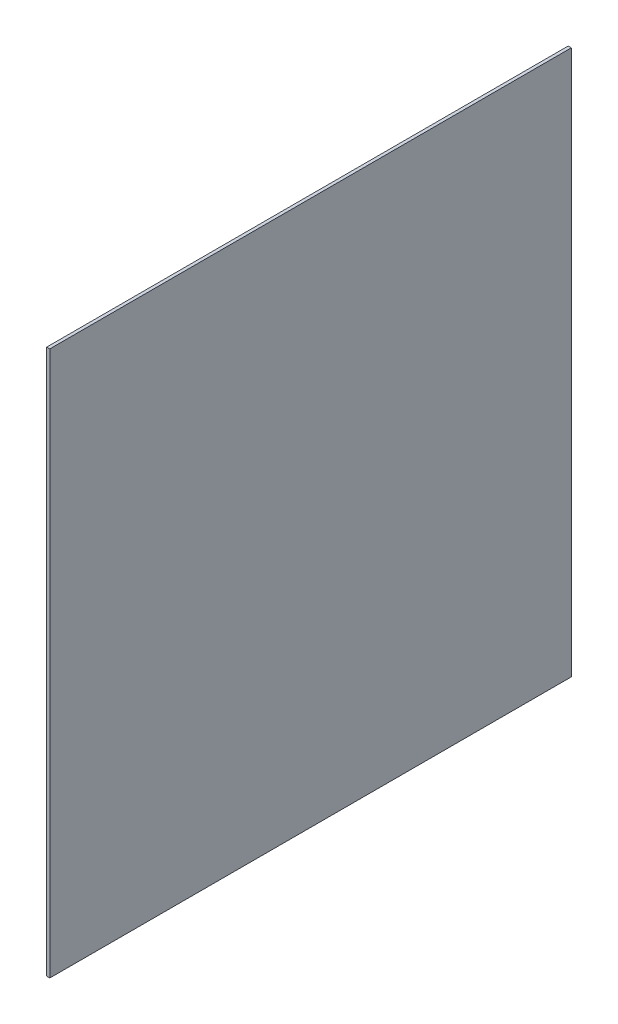
ISO-10303-21;
HEADER;
FILE_DESCRIPTION(('STEP AP214'),'2;1');
FILE_NAME('part.step','',(''),(''),'','','');
FILE_SCHEMA(('AUTOMOTIVE_DESIGN { 1 0 10303 214 1 1 1 1 }'));
ENDSEC;
DATA;
#1=APPLICATION_CONTEXT('core data for automotive mechanical design processes');
#2=APPLICATION_PROTOCOL_DEFINITION('international standard','automotive_design',2000,#1);
#3=PRODUCT_CONTEXT('',#1,'mechanical');
#4=PRODUCT('Part','Part','',(#3));
#5=PRODUCT_RELATED_PRODUCT_CATEGORY('part','',(#4));
#6=PRODUCT_DEFINITION_FORMATION('','',#4);
#7=PRODUCT_DEFINITION_CONTEXT('part definition',#1,'design');
#8=PRODUCT_DEFINITION('design','',#6,#7);
#9=PRODUCT_DEFINITION_SHAPE('','',#8);
#10=(LENGTH_UNIT() NAMED_UNIT(*) SI_UNIT(.MILLI.,.METRE.));
#11=(NAMED_UNIT(*) PLANE_ANGLE_UNIT() SI_UNIT($,.RADIAN.));
#12=(NAMED_UNIT(*) SI_UNIT($,.STERADIAN.) SOLID_ANGLE_UNIT());
#13=UNCERTAINTY_MEASURE_WITH_UNIT(LENGTH_MEASURE(1.E-05),#10,'distance_accuracy_value','');
#14=(GEOMETRIC_REPRESENTATION_CONTEXT(3) GLOBAL_UNCERTAINTY_ASSIGNED_CONTEXT((#13)) GLOBAL_UNIT_ASSIGNED_CONTEXT((#10,
#11,#12)) REPRESENTATION_CONTEXT('',''));
#15=CARTESIAN_POINT('',(0.,0.,0.));
#16=DIRECTION('',(0.,0.,1.));
#17=DIRECTION('',(1.,0.,0.));
#18=AXIS2_PLACEMENT_3D('',#15,#16,#17);
#19=CARTESIAN_POINT('',(2.,0.,0.));
#20=DIRECTION('',(0.,0.,-1.));
#21=DIRECTION('',(-1.,0.,0.));
#22=AXIS2_PLACEMENT_3D('',#19,#20,#21);
#23=PLANE('',#22);
#24=DIRECTION('',(0.,-1.,0.));
#25=VECTOR('',#24,1.);
#26=CARTESIAN_POINT('',(0.,0.,0.));
#27=LINE('',#26,#25);
#28=CARTESIAN_POINT('',(0.,350.,0.));
#29=VERTEX_POINT('',#28);
#30=CARTESIAN_POINT('',(0.,0.,0.));
#31=VERTEX_POINT('',#30);
#32=EDGE_CURVE('E98',#29,#31,#27,.T.);
#33=ORIENTED_EDGE('',*,*,#32,.T.);
#34=DIRECTION('',(-1.,0.,0.));
#35=VECTOR('',#34,1.);
#36=CARTESIAN_POINT('',(2.,0.,0.));
#37=LINE('',#36,#35);
#38=CARTESIAN_POINT('',(2.,0.,0.));
#39=VERTEX_POINT('',#38);
#40=EDGE_CURVE('E11',#39,#31,#37,.T.);
#41=ORIENTED_EDGE('',*,*,#40,.F.);
#42=DIRECTION('',(0.,-1.,0.));
#43=VECTOR('',#42,1.);
#44=CARTESIAN_POINT('',(2.,0.,0.));
#45=LINE('',#44,#43);
#46=CARTESIAN_POINT('',(2.,350.,0.));
#47=VERTEX_POINT('',#46);
#48=EDGE_CURVE('E86',#47,#39,#45,.T.);
#49=ORIENTED_EDGE('',*,*,#48,.F.);
#50=DIRECTION('',(-1.,0.,0.));
#51=VECTOR('',#50,1.);
#52=CARTESIAN_POINT('',(2.,350.,0.));
#53=LINE('',#52,#51);
#54=EDGE_CURVE('E94',#47,#29,#53,.T.);
#55=ORIENTED_EDGE('',*,*,#54,.T.);
#56=EDGE_LOOP('',(#33,#41,#49,#55));
#57=FACE_BOUND('',#56,.T.);
#58=ADVANCED_FACE('F35',(#57),#23,.F.);
#59=CARTESIAN_POINT('',(2.,0.,0.));
#60=DIRECTION('',(0.,1.,0.));
#61=DIRECTION('',(0.,0.,1.));
#62=AXIS2_PLACEMENT_3D('',#59,#60,#61);
#63=PLANE('',#62);
#64=DIRECTION('',(0.,0.,-1.));
#65=VECTOR('',#64,1.);
#66=CARTESIAN_POINT('',(0.,0.,0.));
#67=LINE('',#66,#65);
#68=CARTESIAN_POINT('',(0.,0.,-335.));
#69=VERTEX_POINT('',#68);
#70=EDGE_CURVE('E90',#31,#69,#67,.T.);
#71=ORIENTED_EDGE('',*,*,#70,.T.);
#72=DIRECTION('',(-1.,0.,0.));
#73=VECTOR('',#72,1.);
#74=CARTESIAN_POINT('',(2.,0.,-335.));
#75=LINE('',#74,#73);
#76=CARTESIAN_POINT('',(2.,0.,-335.));
#77=VERTEX_POINT('',#76);
#78=EDGE_CURVE('E43',#77,#69,#75,.T.);
#79=ORIENTED_EDGE('',*,*,#78,.F.);
#80=DIRECTION('',(0.,0.,-1.));
#81=VECTOR('',#80,1.);
#82=CARTESIAN_POINT('',(2.,0.,0.));
#83=LINE('',#82,#81);
#84=EDGE_CURVE('E81',#39,#77,#83,.T.);
#85=ORIENTED_EDGE('',*,*,#84,.F.);
#86=ORIENTED_EDGE('',*,*,#40,.T.);
#87=EDGE_LOOP('',(#71,#79,#85,#86));
#88=FACE_BOUND('',#87,.T.);
#89=ADVANCED_FACE('F89',(#88),#63,.F.);
#90=CARTESIAN_POINT('',(2.,0.,-335.));
#91=DIRECTION('',(0.,0.,1.));
#92=DIRECTION('',(1.,0.,0.));
#93=AXIS2_PLACEMENT_3D('',#90,#91,#92);
#94=PLANE('',#93);
#95=DIRECTION('',(0.,1.,0.));
#96=VECTOR('',#95,1.);
#97=CARTESIAN_POINT('',(0.,0.,-335.));
#98=LINE('',#97,#96);
#99=CARTESIAN_POINT('',(0.,350.,-335.));
#100=VERTEX_POINT('',#99);
#101=EDGE_CURVE('E68',#69,#100,#98,.T.);
#102=ORIENTED_EDGE('',*,*,#101,.T.);
#103=DIRECTION('',(-1.,0.,0.));
#104=VECTOR('',#103,1.);
#105=CARTESIAN_POINT('',(2.,350.,-335.));
#106=LINE('',#105,#104);
#107=CARTESIAN_POINT('',(2.,350.,-335.));
#108=VERTEX_POINT('',#107);
#109=EDGE_CURVE('E91',#108,#100,#106,.T.);
#110=ORIENTED_EDGE('',*,*,#109,.F.);
#111=DIRECTION('',(0.,1.,0.));
#112=VECTOR('',#111,1.);
#113=CARTESIAN_POINT('',(2.,0.,-335.));
#114=LINE('',#113,#112);
#115=EDGE_CURVE('E84',#77,#108,#114,.T.);
#116=ORIENTED_EDGE('',*,*,#115,.F.);
#117=ORIENTED_EDGE('',*,*,#78,.T.);
#118=EDGE_LOOP('',(#102,#110,#116,#117));
#119=FACE_BOUND('',#118,.T.);
#120=ADVANCED_FACE('F92',(#119),#94,.F.);
#121=CARTESIAN_POINT('',(2.,350.,0.));
#122=DIRECTION('',(0.,-1.,0.));
#123=DIRECTION('',(0.,0.,-1.));
#124=AXIS2_PLACEMENT_3D('',#121,#122,#123);
#125=PLANE('',#124);
#126=DIRECTION('',(0.,0.,1.));
#127=VECTOR('',#126,1.);
#128=CARTESIAN_POINT('',(0.,350.,0.));
#129=LINE('',#128,#127);
#130=EDGE_CURVE('E74',#100,#29,#129,.T.);
#131=ORIENTED_EDGE('',*,*,#130,.T.);
#132=ORIENTED_EDGE('',*,*,#54,.F.);
#133=DIRECTION('',(0.,0.,1.));
#134=VECTOR('',#133,1.);
#135=CARTESIAN_POINT('',(2.,350.,0.));
#136=LINE('',#135,#134);
#137=EDGE_CURVE('E51',#108,#47,#136,.T.);
#138=ORIENTED_EDGE('',*,*,#137,.F.);
#139=ORIENTED_EDGE('',*,*,#109,.T.);
#140=EDGE_LOOP('',(#131,#132,#138,#139));
#141=FACE_BOUND('',#140,.T.);
#142=ADVANCED_FACE('F105',(#141),#125,.F.);
#143=CARTESIAN_POINT('',(2.,0.,0.));
#144=DIRECTION('',(-1.,0.,0.));
#145=DIRECTION('',(0.,0.,1.));
#146=AXIS2_PLACEMENT_3D('',#143,#144,#145);
#147=PLANE('',#146);
#148=ORIENTED_EDGE('',*,*,#48,.T.);
#149=ORIENTED_EDGE('',*,*,#84,.T.);
#150=ORIENTED_EDGE('',*,*,#115,.T.);
#151=ORIENTED_EDGE('',*,*,#137,.T.);
#152=EDGE_LOOP('',(#148,#149,#150,#151));
#153=FACE_BOUND('',#152,.T.);
#154=ADVANCED_FACE('F82',(#153),#147,.F.);
#155=CARTESIAN_POINT('',(0.,0.,0.));
#156=DIRECTION('',(-1.,0.,0.));
#157=DIRECTION('',(0.,0.,1.));
#158=AXIS2_PLACEMENT_3D('',#155,#156,#157);
#159=PLANE('',#158);
#160=ORIENTED_EDGE('',*,*,#32,.F.);
#161=ORIENTED_EDGE('',*,*,#130,.F.);
#162=ORIENTED_EDGE('',*,*,#101,.F.);
#163=ORIENTED_EDGE('',*,*,#70,.F.);
#164=EDGE_LOOP('',(#160,#161,#162,#163));
#165=FACE_BOUND('',#164,.T.);
#166=ADVANCED_FACE('F108',(#165),#159,.T.);
#167=CLOSED_SHELL('',(#58,#89,#120,#142,#154,#166));
#168=MANIFOLD_SOLID_BREP('B2',#167);
#169=ADVANCED_BREP_SHAPE_REPRESENTATION('',(#18,#168),#14);
#170=SHAPE_DEFINITION_REPRESENTATION(#9,#169);
ENDSEC;
END-ISO-10303-21;
